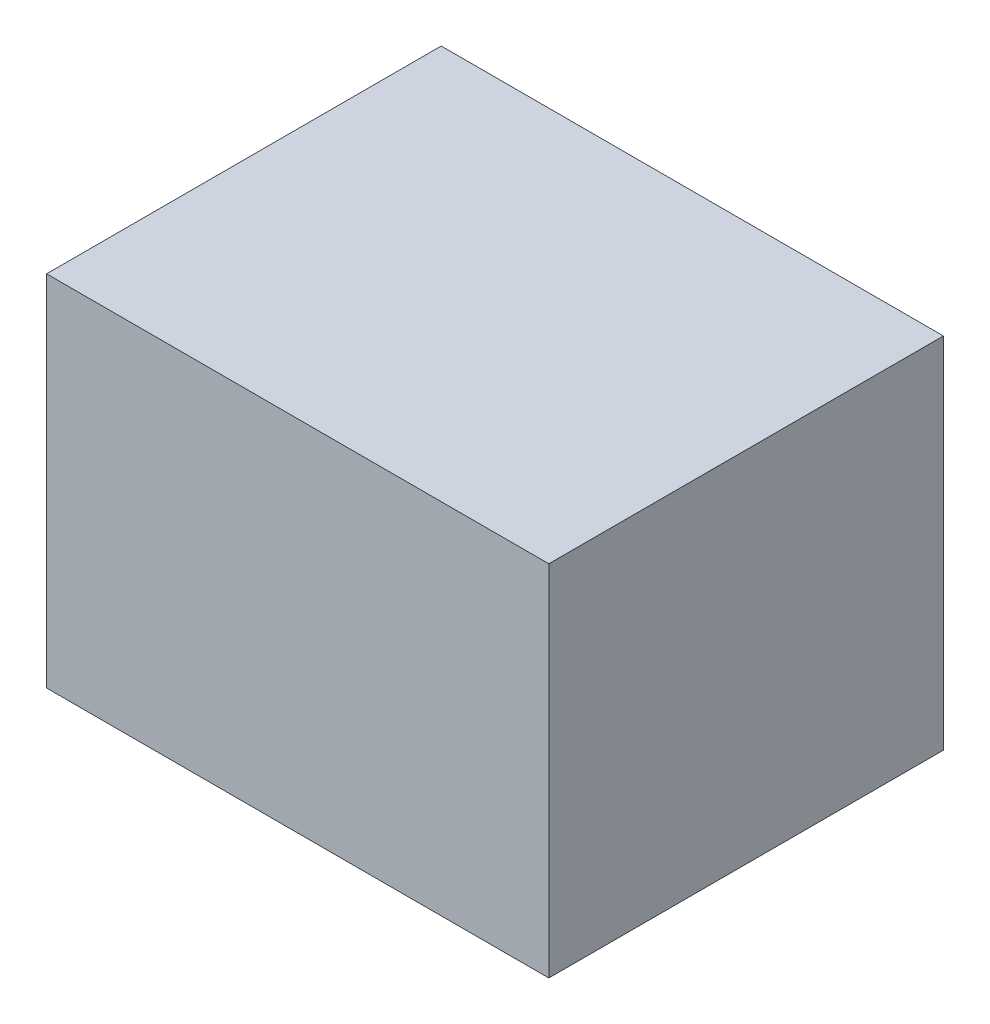
ISO-10303-21;
HEADER;
FILE_DESCRIPTION(('STEP AP214'),'2;1');
FILE_NAME('part.step','',(''),(''),'','','');
FILE_SCHEMA(('AUTOMOTIVE_DESIGN { 1 0 10303 214 1 1 1 1 }'));
ENDSEC;
DATA;
#1=APPLICATION_CONTEXT('core data for automotive mechanical design processes');
#2=APPLICATION_PROTOCOL_DEFINITION('international standard','automotive_design',2000,#1);
#3=PRODUCT_CONTEXT('',#1,'mechanical');
#4=PRODUCT('Part','Part','',(#3));
#5=PRODUCT_RELATED_PRODUCT_CATEGORY('part','',(#4));
#6=PRODUCT_DEFINITION_FORMATION('','',#4);
#7=PRODUCT_DEFINITION_CONTEXT('part definition',#1,'design');
#8=PRODUCT_DEFINITION('design','',#6,#7);
#9=PRODUCT_DEFINITION_SHAPE('','',#8);
#10=(LENGTH_UNIT() NAMED_UNIT(*) SI_UNIT(.MILLI.,.METRE.));
#11=(NAMED_UNIT(*) PLANE_ANGLE_UNIT() SI_UNIT($,.RADIAN.));
#12=(NAMED_UNIT(*) SI_UNIT($,.STERADIAN.) SOLID_ANGLE_UNIT());
#13=UNCERTAINTY_MEASURE_WITH_UNIT(LENGTH_MEASURE(1.E-05),#10,'distance_accuracy_value','');
#14=(GEOMETRIC_REPRESENTATION_CONTEXT(3) GLOBAL_UNCERTAINTY_ASSIGNED_CONTEXT((#13)) GLOBAL_UNIT_ASSIGNED_CONTEXT((#10,
#11,#12)) REPRESENTATION_CONTEXT('',''));
#15=CARTESIAN_POINT('',(0.,0.,0.));
#16=DIRECTION('',(0.,0.,1.));
#17=DIRECTION('',(1.,0.,0.));
#18=AXIS2_PLACEMENT_3D('',#15,#16,#17);
#19=CARTESIAN_POINT('',(71.12,50.8,-55.88));
#20=DIRECTION('',(-1.,0.,0.));
#21=DIRECTION('',(0.,0.,1.));
#22=AXIS2_PLACEMENT_3D('',#19,#20,#21);
#23=PLANE('',#22);
#24=DIRECTION('',(0.,0.,-1.));
#25=VECTOR('',#24,1.);
#26=CARTESIAN_POINT('',(71.12,0.,-55.88));
#27=LINE('',#26,#25);
#28=CARTESIAN_POINT('',(71.12,0.,0.));
#29=VERTEX_POINT('',#28);
#30=CARTESIAN_POINT('',(71.12,0.,-55.88));
#31=VERTEX_POINT('',#30);
#32=EDGE_CURVE('E95',#29,#31,#27,.T.);
#33=ORIENTED_EDGE('',*,*,#32,.T.);
#34=DIRECTION('',(0.,-1.,0.));
#35=VECTOR('',#34,1.);
#36=CARTESIAN_POINT('',(71.12,50.8,-55.88));
#37=LINE('',#36,#35);
#38=CARTESIAN_POINT('',(71.12,50.8,-55.88));
#39=VERTEX_POINT('',#38);
#40=EDGE_CURVE('E11',#39,#31,#37,.T.);
#41=ORIENTED_EDGE('',*,*,#40,.F.);
#42=DIRECTION('',(0.,0.,-1.));
#43=VECTOR('',#42,1.);
#44=CARTESIAN_POINT('',(71.12,50.8,-55.88));
#45=LINE('',#44,#43);
#46=CARTESIAN_POINT('',(71.12,50.8,0.));
#47=VERTEX_POINT('',#46);
#48=EDGE_CURVE('E83',#47,#39,#45,.T.);
#49=ORIENTED_EDGE('',*,*,#48,.F.);
#50=DIRECTION('',(0.,-1.,0.));
#51=VECTOR('',#50,1.);
#52=CARTESIAN_POINT('',(71.12,50.8,0.));
#53=LINE('',#52,#51);
#54=EDGE_CURVE('E91',#47,#29,#53,.T.);
#55=ORIENTED_EDGE('',*,*,#54,.T.);
#56=EDGE_LOOP('',(#33,#41,#49,#55));
#57=FACE_BOUND('',#56,.T.);
#58=ADVANCED_FACE('F32',(#57),#23,.F.);
#59=CARTESIAN_POINT('',(71.12,50.8,-55.88));
#60=DIRECTION('',(0.,0.,1.));
#61=DIRECTION('',(1.,0.,0.));
#62=AXIS2_PLACEMENT_3D('',#59,#60,#61);
#63=PLANE('',#62);
#64=DIRECTION('',(-1.,0.,0.));
#65=VECTOR('',#64,1.);
#66=CARTESIAN_POINT('',(71.12,0.,-55.88));
#67=LINE('',#66,#65);
#68=CARTESIAN_POINT('',(0.,0.,-55.88));
#69=VERTEX_POINT('',#68);
#70=EDGE_CURVE('E87',#31,#69,#67,.T.);
#71=ORIENTED_EDGE('',*,*,#70,.T.);
#72=DIRECTION('',(0.,-1.,0.));
#73=VECTOR('',#72,1.);
#74=CARTESIAN_POINT('',(0.,50.8,-55.88));
#75=LINE('',#74,#73);
#76=CARTESIAN_POINT('',(0.,50.8,-55.88));
#77=VERTEX_POINT('',#76);
#78=EDGE_CURVE('E40',#77,#69,#75,.T.);
#79=ORIENTED_EDGE('',*,*,#78,.F.);
#80=DIRECTION('',(-1.,0.,0.));
#81=VECTOR('',#80,1.);
#82=CARTESIAN_POINT('',(71.12,50.8,-55.88));
#83=LINE('',#82,#81);
#84=EDGE_CURVE('E78',#39,#77,#83,.T.);
#85=ORIENTED_EDGE('',*,*,#84,.F.);
#86=ORIENTED_EDGE('',*,*,#40,.T.);
#87=EDGE_LOOP('',(#71,#79,#85,#86));
#88=FACE_BOUND('',#87,.T.);
#89=ADVANCED_FACE('F86',(#88),#63,.F.);
#90=CARTESIAN_POINT('',(0.,50.8,-55.88));
#91=DIRECTION('',(1.,0.,0.));
#92=DIRECTION('',(0.,0.,-1.));
#93=AXIS2_PLACEMENT_3D('',#90,#91,#92);
#94=PLANE('',#93);
#95=DIRECTION('',(0.,0.,1.));
#96=VECTOR('',#95,1.);
#97=CARTESIAN_POINT('',(0.,0.,-55.88));
#98=LINE('',#97,#96);
#99=CARTESIAN_POINT('',(0.,0.,0.));
#100=VERTEX_POINT('',#99);
#101=EDGE_CURVE('E65',#69,#100,#98,.T.);
#102=ORIENTED_EDGE('',*,*,#101,.T.);
#103=DIRECTION('',(0.,-1.,0.));
#104=VECTOR('',#103,1.);
#105=CARTESIAN_POINT('',(0.,50.8,0.));
#106=LINE('',#105,#104);
#107=CARTESIAN_POINT('',(0.,50.8,0.));
#108=VERTEX_POINT('',#107);
#109=EDGE_CURVE('E88',#108,#100,#106,.T.);
#110=ORIENTED_EDGE('',*,*,#109,.F.);
#111=DIRECTION('',(0.,0.,1.));
#112=VECTOR('',#111,1.);
#113=CARTESIAN_POINT('',(0.,50.8,-55.88));
#114=LINE('',#113,#112);
#115=EDGE_CURVE('E81',#77,#108,#114,.T.);
#116=ORIENTED_EDGE('',*,*,#115,.F.);
#117=ORIENTED_EDGE('',*,*,#78,.T.);
#118=EDGE_LOOP('',(#102,#110,#116,#117));
#119=FACE_BOUND('',#118,.T.);
#120=ADVANCED_FACE('F89',(#119),#94,.F.);
#121=CARTESIAN_POINT('',(71.12,50.8,0.));
#122=DIRECTION('',(0.,0.,-1.));
#123=DIRECTION('',(-1.,0.,0.));
#124=AXIS2_PLACEMENT_3D('',#121,#122,#123);
#125=PLANE('',#124);
#126=DIRECTION('',(1.,0.,0.));
#127=VECTOR('',#126,1.);
#128=CARTESIAN_POINT('',(71.12,0.,0.));
#129=LINE('',#128,#127);
#130=EDGE_CURVE('E71',#100,#29,#129,.T.);
#131=ORIENTED_EDGE('',*,*,#130,.T.);
#132=ORIENTED_EDGE('',*,*,#54,.F.);
#133=DIRECTION('',(1.,0.,0.));
#134=VECTOR('',#133,1.);
#135=CARTESIAN_POINT('',(71.12,50.8,0.));
#136=LINE('',#135,#134);
#137=EDGE_CURVE('E48',#108,#47,#136,.T.);
#138=ORIENTED_EDGE('',*,*,#137,.F.);
#139=ORIENTED_EDGE('',*,*,#109,.T.);
#140=EDGE_LOOP('',(#131,#132,#138,#139));
#141=FACE_BOUND('',#140,.T.);
#142=ADVANCED_FACE('F102',(#141),#125,.F.);
#143=CARTESIAN_POINT('',(0.,50.8,0.));
#144=DIRECTION('',(0.,-1.,0.));
#145=DIRECTION('',(0.,0.,-1.));
#146=AXIS2_PLACEMENT_3D('',#143,#144,#145);
#147=PLANE('',#146);
#148=ORIENTED_EDGE('',*,*,#48,.T.);
#149=ORIENTED_EDGE('',*,*,#84,.T.);
#150=ORIENTED_EDGE('',*,*,#115,.T.);
#151=ORIENTED_EDGE('',*,*,#137,.T.);
#152=EDGE_LOOP('',(#148,#149,#150,#151));
#153=FACE_BOUND('',#152,.T.);
#154=ADVANCED_FACE('F79',(#153),#147,.F.);
#155=CARTESIAN_POINT('',(0.,0.,0.));
#156=DIRECTION('',(0.,-1.,0.));
#157=DIRECTION('',(0.,0.,-1.));
#158=AXIS2_PLACEMENT_3D('',#155,#156,#157);
#159=PLANE('',#158);
#160=ORIENTED_EDGE('',*,*,#32,.F.);
#161=ORIENTED_EDGE('',*,*,#130,.F.);
#162=ORIENTED_EDGE('',*,*,#101,.F.);
#163=ORIENTED_EDGE('',*,*,#70,.F.);
#164=EDGE_LOOP('',(#160,#161,#162,#163));
#165=FACE_BOUND('',#164,.T.);
#166=ADVANCED_FACE('F105',(#165),#159,.T.);
#167=CLOSED_SHELL('',(#58,#89,#120,#142,#154,#166));
#168=MANIFOLD_SOLID_BREP('B2',#167);
#169=ADVANCED_BREP_SHAPE_REPRESENTATION('',(#18,#168),#14);
#170=SHAPE_DEFINITION_REPRESENTATION(#9,#169);
ENDSEC;
END-ISO-10303-21;
